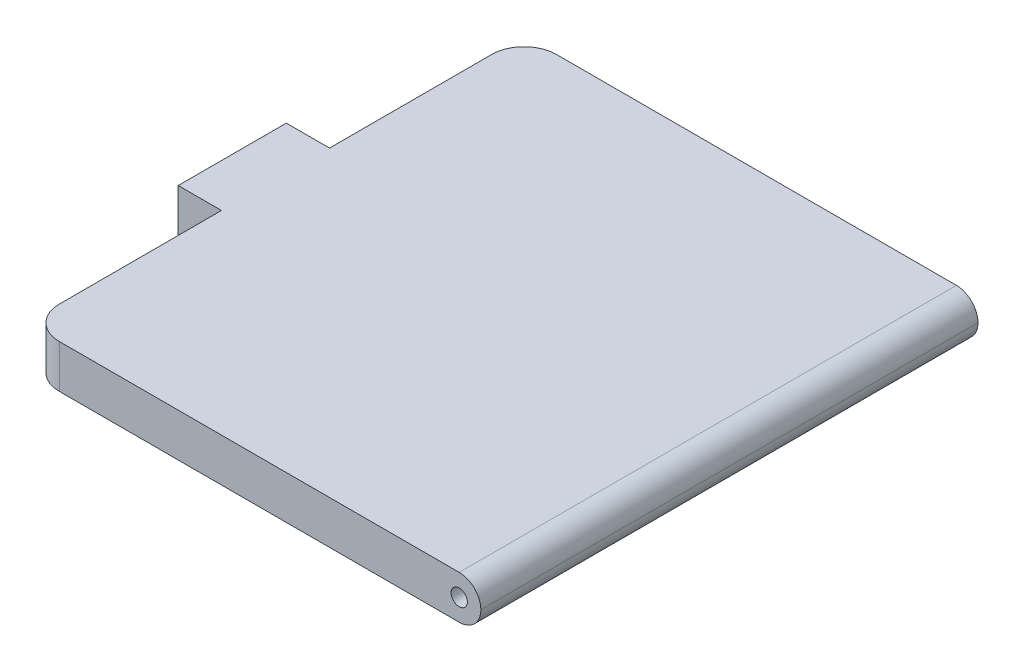
ISO-10303-21;
HEADER;
FILE_DESCRIPTION(('STEP AP214'),'2;1');
FILE_NAME('part.step','',(''),(''),'','','');
FILE_SCHEMA(('AUTOMOTIVE_DESIGN { 1 0 10303 214 1 1 1 1 }'));
ENDSEC;
DATA;
#1=APPLICATION_CONTEXT('core data for automotive mechanical design processes');
#2=APPLICATION_PROTOCOL_DEFINITION('international standard','automotive_design',2000,#1);
#3=PRODUCT_CONTEXT('',#1,'mechanical');
#4=PRODUCT('Part','Part','',(#3));
#5=PRODUCT_RELATED_PRODUCT_CATEGORY('part','',(#4));
#6=PRODUCT_DEFINITION_FORMATION('','',#4);
#7=PRODUCT_DEFINITION_CONTEXT('part definition',#1,'design');
#8=PRODUCT_DEFINITION('design','',#6,#7);
#9=PRODUCT_DEFINITION_SHAPE('','',#8);
#10=(LENGTH_UNIT() NAMED_UNIT(*) SI_UNIT(.MILLI.,.METRE.));
#11=(NAMED_UNIT(*) PLANE_ANGLE_UNIT() SI_UNIT($,.RADIAN.));
#12=(NAMED_UNIT(*) SI_UNIT($,.STERADIAN.) SOLID_ANGLE_UNIT());
#13=UNCERTAINTY_MEASURE_WITH_UNIT(LENGTH_MEASURE(1.E-05),#10,'distance_accuracy_value','');
#14=(GEOMETRIC_REPRESENTATION_CONTEXT(3) GLOBAL_UNCERTAINTY_ASSIGNED_CONTEXT((#13)) GLOBAL_UNIT_ASSIGNED_CONTEXT((#10,
#11,#12)) REPRESENTATION_CONTEXT('',''));
#15=CARTESIAN_POINT('',(0.,0.,0.));
#16=DIRECTION('',(0.,0.,1.));
#17=DIRECTION('',(1.,0.,0.));
#18=AXIS2_PLACEMENT_3D('',#15,#16,#17);
#19=CARTESIAN_POINT('',(-47.,1.,5.));
#20=DIRECTION('',(0.,1.,0.));
#21=DIRECTION('',(0.,0.,1.));
#22=AXIS2_PLACEMENT_3D('',#19,#20,#21);
#23=PLANE('',#22);
#24=DIRECTION('',(0.,0.,1.));
#25=VECTOR('',#24,1.);
#26=CARTESIAN_POINT('',(-45.,1.,5.));
#27=LINE('',#26,#25);
#28=CARTESIAN_POINT('',(-45.,1.,-5.));
#29=VERTEX_POINT('',#28);
#30=CARTESIAN_POINT('',(-45.,1.,5.));
#31=VERTEX_POINT('',#30);
#32=EDGE_CURVE('E147',#29,#31,#27,.T.);
#33=ORIENTED_EDGE('',*,*,#32,.F.);
#34=DIRECTION('',(1.,0.,0.));
#35=VECTOR('',#34,1.);
#36=CARTESIAN_POINT('',(-47.,1.,-5.));
#37=LINE('',#36,#35);
#38=CARTESIAN_POINT('',(-43.,1.,-5.));
#39=VERTEX_POINT('',#38);
#40=EDGE_CURVE('E152',#29,#39,#37,.T.);
#41=ORIENTED_EDGE('',*,*,#40,.T.);
#42=DIRECTION('',(0.,0.,1.));
#43=VECTOR('',#42,1.);
#44=CARTESIAN_POINT('',(-43.,1.,5.));
#45=LINE('',#44,#43);
#46=CARTESIAN_POINT('',(-43.,1.,5.));
#47=VERTEX_POINT('',#46);
#48=EDGE_CURVE('E155',#39,#47,#45,.T.);
#49=ORIENTED_EDGE('',*,*,#48,.T.);
#50=DIRECTION('',(1.,0.,0.));
#51=VECTOR('',#50,1.);
#52=CARTESIAN_POINT('',(-47.,1.,5.));
#53=LINE('',#52,#51);
#54=EDGE_CURVE('E172',#31,#47,#53,.T.);
#55=ORIENTED_EDGE('',*,*,#54,.F.);
#56=EDGE_LOOP('',(#33,#41,#49,#55));
#57=FACE_BOUND('',#56,.T.);
#58=ADVANCED_FACE('F32',(#57),#23,.F.);
#59=CARTESIAN_POINT('',(-43.,4.,20.));
#60=DIRECTION('',(1.,0.,0.));
#61=DIRECTION('',(0.,0.,-1.));
#62=AXIS2_PLACEMENT_3D('',#59,#60,#61);
#63=PLANE('',#62);
#64=DIRECTION('',(0.,-1.,0.));
#65=VECTOR('',#64,1.);
#66=CARTESIAN_POINT('',(-43.,1.,-5.));
#67=LINE('',#66,#65);
#68=CARTESIAN_POINT('',(-43.,4.,-5.));
#69=VERTEX_POINT('',#68);
#70=EDGE_CURVE('E153',#69,#39,#67,.T.);
#71=ORIENTED_EDGE('',*,*,#70,.F.);
#72=DIRECTION('',(0.,0.,1.));
#73=VECTOR('',#72,1.);
#74=CARTESIAN_POINT('',(-43.,4.,20.));
#75=LINE('',#74,#73);
#76=CARTESIAN_POINT('',(-43.,4.,-20.));
#77=VERTEX_POINT('',#76);
#78=EDGE_CURVE('E194',#77,#69,#75,.T.);
#79=ORIENTED_EDGE('',*,*,#78,.F.);
#80=DIRECTION('',(0.,-1.,0.));
#81=VECTOR('',#80,1.);
#82=CARTESIAN_POINT('',(-43.,4.,-20.));
#83=LINE('',#82,#81);
#84=CARTESIAN_POINT('',(-43.,0.,-20.));
#85=VERTEX_POINT('',#84);
#86=EDGE_CURVE('E211',#77,#85,#83,.T.);
#87=ORIENTED_EDGE('',*,*,#86,.T.);
#88=DIRECTION('',(0.,0.,1.));
#89=VECTOR('',#88,1.);
#90=CARTESIAN_POINT('',(-43.,0.,20.));
#91=LINE('',#90,#89);
#92=CARTESIAN_POINT('',(-43.,0.,20.));
#93=VERTEX_POINT('',#92);
#94=EDGE_CURVE('E187',#85,#93,#91,.T.);
#95=ORIENTED_EDGE('',*,*,#94,.T.);
#96=DIRECTION('',(0.,-1.,0.));
#97=VECTOR('',#96,1.);
#98=CARTESIAN_POINT('',(-43.,4.,20.));
#99=LINE('',#98,#97);
#100=CARTESIAN_POINT('',(-43.,4.,20.));
#101=VERTEX_POINT('',#100);
#102=EDGE_CURVE('E197',#101,#93,#99,.T.);
#103=ORIENTED_EDGE('',*,*,#102,.F.);
#104=CARTESIAN_POINT('',(-43.,4.,5.));
#105=VERTEX_POINT('',#104);
#106=EDGE_CURVE('E193',#105,#101,#75,.T.);
#107=ORIENTED_EDGE('',*,*,#106,.F.);
#108=DIRECTION('',(0.,1.,0.));
#109=VECTOR('',#108,1.);
#110=CARTESIAN_POINT('',(-43.,4.,5.));
#111=LINE('',#110,#109);
#112=EDGE_CURVE('E164',#47,#105,#111,.T.);
#113=ORIENTED_EDGE('',*,*,#112,.F.);
#114=ORIENTED_EDGE('',*,*,#48,.F.);
#115=EDGE_LOOP('',(#71,#79,#87,#95,#103,#107,#113,#114));
#116=FACE_BOUND('',#115,.T.);
#117=ADVANCED_FACE('F255',(#116),#63,.F.);
#118=CARTESIAN_POINT('',(-40.,4.,20.));
#119=DIRECTION('',(0.,-1.,0.));
#120=DIRECTION('',(0.,0.,-1.));
#121=AXIS2_PLACEMENT_3D('',#118,#119,#120);
#122=CYLINDRICAL_SURFACE('',#121,3.);
#123=CARTESIAN_POINT('',(-40.,0.,20.));
#124=DIRECTION('',(0.,1.,0.));
#125=DIRECTION('',(0.,0.,-1.));
#126=AXIS2_PLACEMENT_3D('',#123,#124,#125);
#127=CIRCLE('',#126,3.);
#128=CARTESIAN_POINT('',(-40.,0.,23.));
#129=VERTEX_POINT('',#128);
#130=EDGE_CURVE('E198',#93,#129,#127,.T.);
#131=ORIENTED_EDGE('',*,*,#130,.T.);
#132=DIRECTION('',(0.,-1.,0.));
#133=VECTOR('',#132,1.);
#134=CARTESIAN_POINT('',(-40.,4.,23.));
#135=LINE('',#134,#133);
#136=CARTESIAN_POINT('',(-40.,4.,23.));
#137=VERTEX_POINT('',#136);
#138=EDGE_CURVE('E217',#137,#129,#135,.T.);
#139=ORIENTED_EDGE('',*,*,#138,.F.);
#140=CARTESIAN_POINT('',(-40.,4.,20.));
#141=DIRECTION('',(0.,1.,0.));
#142=DIRECTION('',(0.,0.,-1.));
#143=AXIS2_PLACEMENT_3D('',#140,#141,#142);
#144=CIRCLE('',#143,3.);
#145=EDGE_CURVE('E183',#101,#137,#144,.T.);
#146=ORIENTED_EDGE('',*,*,#145,.F.);
#147=ORIENTED_EDGE('',*,*,#102,.T.);
#148=EDGE_LOOP('',(#131,#139,#146,#147));
#149=FACE_BOUND('',#148,.T.);
#150=ADVANCED_FACE('F263',(#149),#122,.T.);
#151=CARTESIAN_POINT('',(-0.999999999999994,4.,23.));
#152=DIRECTION('',(0.,0.,-1.));
#153=DIRECTION('',(-1.,0.,0.));
#154=AXIS2_PLACEMENT_3D('',#151,#152,#153);
#155=PLANE('',#154);
#156=CARTESIAN_POINT('',(-3.,2.,23.));
#157=DIRECTION('',(0.,0.,1.));
#158=DIRECTION('',(1.,0.,0.));
#159=AXIS2_PLACEMENT_3D('',#156,#157,#158);
#160=CIRCLE('',#159,0.75);
#161=CARTESIAN_POINT('',(-2.25,2.,23.));
#162=VERTEX_POINT('',#161);
#163=EDGE_CURVE('E177',#162,#162,#160,.T.);
#164=ORIENTED_EDGE('',*,*,#163,.F.);
#165=EDGE_LOOP('',(#164));
#166=FACE_BOUND('',#165,.T.);
#167=DIRECTION('',(1.,0.,0.));
#168=VECTOR('',#167,1.);
#169=CARTESIAN_POINT('',(-0.999999999999994,0.,23.));
#170=LINE('',#169,#168);
#171=CARTESIAN_POINT('',(-2.99999999999999,0.,23.));
#172=VERTEX_POINT('',#171);
#173=EDGE_CURVE('E201',#129,#172,#170,.T.);
#174=ORIENTED_EDGE('',*,*,#173,.T.);
#175=CARTESIAN_POINT('',(-2.99999999999999,2.,23.));
#176=DIRECTION('',(0.,0.,-1.));
#177=DIRECTION('',(-1.,0.,0.));
#178=AXIS2_PLACEMENT_3D('',#175,#176,#177);
#179=CIRCLE('',#178,2.);
#180=CARTESIAN_POINT('',(-0.999999999999994,2.,23.));
#181=VERTEX_POINT('',#180);
#182=EDGE_CURVE('E41',#172,#181,#179,.F.);
#183=ORIENTED_EDGE('',*,*,#182,.T.);
#184=CARTESIAN_POINT('',(-3.,2.,23.));
#185=DIRECTION('',(0.,0.,-1.));
#186=DIRECTION('',(-1.,0.,0.));
#187=AXIS2_PLACEMENT_3D('',#184,#185,#186);
#188=CIRCLE('',#187,2.);
#189=CARTESIAN_POINT('',(-3.,4.,23.));
#190=VERTEX_POINT('',#189);
#191=EDGE_CURVE('E56',#181,#190,#188,.F.);
#192=ORIENTED_EDGE('',*,*,#191,.T.);
#193=DIRECTION('',(1.,0.,0.));
#194=VECTOR('',#193,1.);
#195=CARTESIAN_POINT('',(-0.999999999999994,4.,23.));
#196=LINE('',#195,#194);
#197=EDGE_CURVE('E186',#137,#190,#196,.T.);
#198=ORIENTED_EDGE('',*,*,#197,.F.);
#199=ORIENTED_EDGE('',*,*,#138,.T.);
#200=EDGE_LOOP('',(#174,#183,#192,#198,#199));
#201=FACE_BOUND('',#200,.T.);
#202=ADVANCED_FACE('F228',(#166,#201),#155,.F.);
#203=CARTESIAN_POINT('',(-1.,4.,-23.));
#204=DIRECTION('',(0.,0.,1.));
#205=DIRECTION('',(1.,0.,0.));
#206=AXIS2_PLACEMENT_3D('',#203,#204,#205);
#207=PLANE('',#206);
#208=CARTESIAN_POINT('',(-3.,2.,-23.));
#209=DIRECTION('',(0.,0.,1.));
#210=DIRECTION('',(1.,0.,0.));
#211=AXIS2_PLACEMENT_3D('',#208,#209,#210);
#212=CIRCLE('',#211,0.75);
#213=CARTESIAN_POINT('',(-2.25,2.,-23.));
#214=VERTEX_POINT('',#213);
#215=EDGE_CURVE('E180',#214,#214,#212,.F.);
#216=ORIENTED_EDGE('',*,*,#215,.F.);
#217=EDGE_LOOP('',(#216));
#218=FACE_BOUND('',#217,.T.);
#219=CARTESIAN_POINT('',(-3.,2.,-23.));
#220=DIRECTION('',(0.,0.,1.));
#221=DIRECTION('',(1.,0.,0.));
#222=AXIS2_PLACEMENT_3D('',#219,#220,#221);
#223=CIRCLE('',#222,2.);
#224=CARTESIAN_POINT('',(-3.,4.,-23.));
#225=VERTEX_POINT('',#224);
#226=CARTESIAN_POINT('',(-1.,2.,-23.));
#227=VERTEX_POINT('',#226);
#228=EDGE_CURVE('E220',#225,#227,#223,.F.);
#229=ORIENTED_EDGE('',*,*,#228,.T.);
#230=CARTESIAN_POINT('',(-3.,2.,-23.));
#231=DIRECTION('',(0.,0.,1.));
#232=DIRECTION('',(1.,0.,0.));
#233=AXIS2_PLACEMENT_3D('',#230,#231,#232);
#234=CIRCLE('',#233,2.);
#235=CARTESIAN_POINT('',(-3.,0.,-23.));
#236=VERTEX_POINT('',#235);
#237=EDGE_CURVE('E222',#227,#236,#234,.F.);
#238=ORIENTED_EDGE('',*,*,#237,.T.);
#239=DIRECTION('',(-1.,0.,0.));
#240=VECTOR('',#239,1.);
#241=CARTESIAN_POINT('',(-1.,0.,-23.));
#242=LINE('',#241,#240);
#243=CARTESIAN_POINT('',(-40.,0.,-23.));
#244=VERTEX_POINT('',#243);
#245=EDGE_CURVE('E204',#236,#244,#242,.T.);
#246=ORIENTED_EDGE('',*,*,#245,.T.);
#247=DIRECTION('',(0.,-1.,0.));
#248=VECTOR('',#247,1.);
#249=CARTESIAN_POINT('',(-40.,4.,-23.));
#250=LINE('',#249,#248);
#251=CARTESIAN_POINT('',(-40.,4.,-23.));
#252=VERTEX_POINT('',#251);
#253=EDGE_CURVE('E214',#252,#244,#250,.T.);
#254=ORIENTED_EDGE('',*,*,#253,.F.);
#255=DIRECTION('',(-1.,0.,0.));
#256=VECTOR('',#255,1.);
#257=CARTESIAN_POINT('',(-1.,4.,-23.));
#258=LINE('',#257,#256);
#259=EDGE_CURVE('E189',#225,#252,#258,.T.);
#260=ORIENTED_EDGE('',*,*,#259,.F.);
#261=EDGE_LOOP('',(#229,#238,#246,#254,#260));
#262=FACE_BOUND('',#261,.T.);
#263=ADVANCED_FACE('F240',(#218,#262),#207,.F.);
#264=CARTESIAN_POINT('',(-40.,4.,-20.));
#265=DIRECTION('',(0.,-1.,0.));
#266=DIRECTION('',(0.,0.,-1.));
#267=AXIS2_PLACEMENT_3D('',#264,#265,#266);
#268=CYLINDRICAL_SURFACE('',#267,3.);
#269=CARTESIAN_POINT('',(-40.,0.,-20.));
#270=DIRECTION('',(0.,1.,0.));
#271=DIRECTION('',(0.,0.,1.));
#272=AXIS2_PLACEMENT_3D('',#269,#270,#271);
#273=CIRCLE('',#272,3.);
#274=EDGE_CURVE('E206',#244,#85,#273,.T.);
#275=ORIENTED_EDGE('',*,*,#274,.T.);
#276=ORIENTED_EDGE('',*,*,#86,.F.);
#277=CARTESIAN_POINT('',(-40.,4.,-20.));
#278=DIRECTION('',(0.,1.,0.));
#279=DIRECTION('',(0.,0.,1.));
#280=AXIS2_PLACEMENT_3D('',#277,#278,#279);
#281=CIRCLE('',#280,3.);
#282=EDGE_CURVE('E191',#252,#77,#281,.T.);
#283=ORIENTED_EDGE('',*,*,#282,.F.);
#284=ORIENTED_EDGE('',*,*,#253,.T.);
#285=EDGE_LOOP('',(#275,#276,#283,#284));
#286=FACE_BOUND('',#285,.T.);
#287=ADVANCED_FACE('F250',(#286),#268,.T.);
#288=CARTESIAN_POINT('',(-40.,4.,20.));
#289=DIRECTION('',(0.,-1.,0.));
#290=DIRECTION('',(0.,0.,-1.));
#291=AXIS2_PLACEMENT_3D('',#288,#289,#290);
#292=PLANE('',#291);
#293=ORIENTED_EDGE('',*,*,#197,.T.);
#294=DIRECTION('',(0.,0.,-1.));
#295=VECTOR('',#294,1.);
#296=CARTESIAN_POINT('',(-3.,4.,20.));
#297=LINE('',#296,#295);
#298=EDGE_CURVE('E11',#190,#225,#297,.T.);
#299=ORIENTED_EDGE('',*,*,#298,.T.);
#300=ORIENTED_EDGE('',*,*,#259,.T.);
#301=ORIENTED_EDGE('',*,*,#282,.T.);
#302=ORIENTED_EDGE('',*,*,#78,.T.);
#303=DIRECTION('',(1.,0.,0.));
#304=VECTOR('',#303,1.);
#305=CARTESIAN_POINT('',(-47.,4.,-5.));
#306=LINE('',#305,#304);
#307=CARTESIAN_POINT('',(-47.,4.,-5.));
#308=VERTEX_POINT('',#307);
#309=EDGE_CURVE('E175',#308,#69,#306,.T.);
#310=ORIENTED_EDGE('',*,*,#309,.F.);
#311=DIRECTION('',(0.,0.,-1.));
#312=VECTOR('',#311,1.);
#313=CARTESIAN_POINT('',(-47.,4.,-5.));
#314=LINE('',#313,#312);
#315=CARTESIAN_POINT('',(-47.,4.,5.));
#316=VERTEX_POINT('',#315);
#317=EDGE_CURVE('E160',#316,#308,#314,.T.);
#318=ORIENTED_EDGE('',*,*,#317,.F.);
#319=DIRECTION('',(1.,0.,0.));
#320=VECTOR('',#319,1.);
#321=CARTESIAN_POINT('',(-47.,4.,5.));
#322=LINE('',#321,#320);
#323=EDGE_CURVE('E48',#316,#105,#322,.T.);
#324=ORIENTED_EDGE('',*,*,#323,.T.);
#325=ORIENTED_EDGE('',*,*,#106,.T.);
#326=ORIENTED_EDGE('',*,*,#145,.T.);
#327=EDGE_LOOP('',(#293,#299,#300,#301,#302,#310,#318,#324,#325,#326));
#328=FACE_BOUND('',#327,.T.);
#329=ADVANCED_FACE('F259',(#328),#292,.F.);
#330=CARTESIAN_POINT('',(-40.,0.,20.));
#331=DIRECTION('',(0.,-1.,0.));
#332=DIRECTION('',(0.,0.,-1.));
#333=AXIS2_PLACEMENT_3D('',#330,#331,#332);
#334=PLANE('',#333);
#335=ORIENTED_EDGE('',*,*,#245,.F.);
#336=DIRECTION('',(0.,0.,-1.));
#337=VECTOR('',#336,1.);
#338=CARTESIAN_POINT('',(-2.99999999999999,0.,23.));
#339=LINE('',#338,#337);
#340=EDGE_CURVE('E224',#236,#172,#339,.F.);
#341=ORIENTED_EDGE('',*,*,#340,.T.);
#342=ORIENTED_EDGE('',*,*,#173,.F.);
#343=ORIENTED_EDGE('',*,*,#130,.F.);
#344=ORIENTED_EDGE('',*,*,#94,.F.);
#345=ORIENTED_EDGE('',*,*,#274,.F.);
#346=EDGE_LOOP('',(#335,#341,#342,#343,#344,#345));
#347=FACE_BOUND('',#346,.T.);
#348=ADVANCED_FACE('F245',(#347),#334,.T.);
#349=CARTESIAN_POINT('',(-3.,2.,20.));
#350=DIRECTION('',(0.,0.,-1.));
#351=DIRECTION('',(-1.,0.,0.));
#352=AXIS2_PLACEMENT_3D('',#349,#350,#351);
#353=CYLINDRICAL_SURFACE('',#352,2.);
#354=ORIENTED_EDGE('',*,*,#298,.F.);
#355=ORIENTED_EDGE('',*,*,#191,.F.);
#356=DIRECTION('',(0.,0.,-1.));
#357=VECTOR('',#356,1.);
#358=CARTESIAN_POINT('',(-1.,2.,-23.));
#359=LINE('',#358,#357);
#360=EDGE_CURVE('E36',#227,#181,#359,.F.);
#361=ORIENTED_EDGE('',*,*,#360,.F.);
#362=ORIENTED_EDGE('',*,*,#228,.F.);
#363=EDGE_LOOP('',(#354,#355,#361,#362));
#364=FACE_BOUND('',#363,.T.);
#365=ADVANCED_FACE('F34',(#364),#353,.T.);
#366=CARTESIAN_POINT('',(-3.,2.,-23.));
#367=DIRECTION('',(0.,0.,1.));
#368=DIRECTION('',(1.,0.,0.));
#369=AXIS2_PLACEMENT_3D('',#366,#367,#368);
#370=CYLINDRICAL_SURFACE('',#369,2.);
#371=ORIENTED_EDGE('',*,*,#182,.F.);
#372=ORIENTED_EDGE('',*,*,#340,.F.);
#373=ORIENTED_EDGE('',*,*,#237,.F.);
#374=ORIENTED_EDGE('',*,*,#360,.T.);
#375=EDGE_LOOP('',(#371,#372,#373,#374));
#376=FACE_BOUND('',#375,.T.);
#377=ADVANCED_FACE('F237',(#376),#370,.T.);
#378=CARTESIAN_POINT('',(-3.,2.,-25.1213203435596));
#379=DIRECTION('',(0.,0.,1.));
#380=DIRECTION('',(1.,0.,0.));
#381=AXIS2_PLACEMENT_3D('',#378,#379,#380);
#382=CYLINDRICAL_SURFACE('',#381,0.75);
#383=ORIENTED_EDGE('',*,*,#215,.T.);
#384=EDGE_LOOP('',(#383));
#385=FACE_BOUND('',#384,.T.);
#386=ORIENTED_EDGE('',*,*,#163,.T.);
#387=EDGE_LOOP('',(#386));
#388=FACE_BOUND('',#387,.T.);
#389=ADVANCED_FACE('F291',(#385,#388),#382,.F.);
#390=CARTESIAN_POINT('',(-47.,1.,-5.));
#391=DIRECTION('',(0.,0.,1.));
#392=DIRECTION('',(0.,-1.,0.));
#393=AXIS2_PLACEMENT_3D('',#390,#391,#392);
#394=PLANE('',#393);
#395=ORIENTED_EDGE('',*,*,#70,.T.);
#396=ORIENTED_EDGE('',*,*,#40,.F.);
#397=DIRECTION('',(0.,1.,0.));
#398=VECTOR('',#397,1.);
#399=CARTESIAN_POINT('',(-45.,-4.,-5.));
#400=LINE('',#399,#398);
#401=CARTESIAN_POINT('',(-45.,-4.,-5.));
#402=VERTEX_POINT('',#401);
#403=EDGE_CURVE('E131',#402,#29,#400,.T.);
#404=ORIENTED_EDGE('',*,*,#403,.F.);
#405=DIRECTION('',(1.,0.,0.));
#406=VECTOR('',#405,1.);
#407=CARTESIAN_POINT('',(-45.,-4.,-5.));
#408=LINE('',#407,#406);
#409=CARTESIAN_POINT('',(-47.,-4.,-5.));
#410=VERTEX_POINT('',#409);
#411=EDGE_CURVE('E139',#410,#402,#408,.T.);
#412=ORIENTED_EDGE('',*,*,#411,.F.);
#413=DIRECTION('',(0.,-1.,0.));
#414=VECTOR('',#413,1.);
#415=CARTESIAN_POINT('',(-47.,1.,-5.));
#416=LINE('',#415,#414);
#417=EDGE_CURVE('E163',#308,#410,#416,.T.);
#418=ORIENTED_EDGE('',*,*,#417,.F.);
#419=ORIENTED_EDGE('',*,*,#309,.T.);
#420=EDGE_LOOP('',(#395,#396,#404,#412,#418,#419));
#421=FACE_BOUND('',#420,.T.);
#422=ADVANCED_FACE('F151',(#421),#394,.F.);
#423=CARTESIAN_POINT('',(-47.,4.,5.));
#424=DIRECTION('',(0.,0.,-1.));
#425=DIRECTION('',(0.,1.,0.));
#426=AXIS2_PLACEMENT_3D('',#423,#424,#425);
#427=PLANE('',#426);
#428=ORIENTED_EDGE('',*,*,#112,.T.);
#429=ORIENTED_EDGE('',*,*,#323,.F.);
#430=DIRECTION('',(0.,1.,0.));
#431=VECTOR('',#430,1.);
#432=CARTESIAN_POINT('',(-47.,4.,5.));
#433=LINE('',#432,#431);
#434=CARTESIAN_POINT('',(-47.,-4.,5.));
#435=VERTEX_POINT('',#434);
#436=EDGE_CURVE('E166',#435,#316,#433,.T.);
#437=ORIENTED_EDGE('',*,*,#436,.F.);
#438=DIRECTION('',(-1.,0.,0.));
#439=VECTOR('',#438,1.);
#440=CARTESIAN_POINT('',(-47.,-4.,5.));
#441=LINE('',#440,#439);
#442=CARTESIAN_POINT('',(-45.,-4.,5.));
#443=VERTEX_POINT('',#442);
#444=EDGE_CURVE('E138',#443,#435,#441,.T.);
#445=ORIENTED_EDGE('',*,*,#444,.F.);
#446=DIRECTION('',(0.,1.,0.));
#447=VECTOR('',#446,1.);
#448=CARTESIAN_POINT('',(-45.,-4.,5.));
#449=LINE('',#448,#447);
#450=EDGE_CURVE('E134',#443,#31,#449,.T.);
#451=ORIENTED_EDGE('',*,*,#450,.T.);
#452=ORIENTED_EDGE('',*,*,#54,.T.);
#453=EDGE_LOOP('',(#428,#429,#437,#445,#451,#452));
#454=FACE_BOUND('',#453,.T.);
#455=ADVANCED_FACE('F267',(#454),#427,.F.);
#456=CARTESIAN_POINT('',(-47.,0.,0.));
#457=DIRECTION('',(1.,0.,0.));
#458=DIRECTION('',(0.,0.,-1.));
#459=AXIS2_PLACEMENT_3D('',#456,#457,#458);
#460=PLANE('',#459);
#461=ORIENTED_EDGE('',*,*,#317,.T.);
#462=ORIENTED_EDGE('',*,*,#417,.T.);
#463=DIRECTION('',(0.,0.,-1.));
#464=VECTOR('',#463,1.);
#465=CARTESIAN_POINT('',(-47.,-4.,-5.));
#466=LINE('',#465,#464);
#467=EDGE_CURVE('E145',#435,#410,#466,.T.);
#468=ORIENTED_EDGE('',*,*,#467,.F.);
#469=ORIENTED_EDGE('',*,*,#436,.T.);
#470=EDGE_LOOP('',(#461,#462,#468,#469));
#471=FACE_BOUND('',#470,.T.);
#472=ADVANCED_FACE('F271',(#471),#460,.F.);
#473=CARTESIAN_POINT('',(-45.,-4.,5.));
#474=DIRECTION('',(-1.,0.,0.));
#475=DIRECTION('',(0.,0.,1.));
#476=AXIS2_PLACEMENT_3D('',#473,#474,#475);
#477=PLANE('',#476);
#478=ORIENTED_EDGE('',*,*,#32,.T.);
#479=ORIENTED_EDGE('',*,*,#450,.F.);
#480=DIRECTION('',(0.,0.,1.));
#481=VECTOR('',#480,1.);
#482=CARTESIAN_POINT('',(-45.,-4.,5.));
#483=LINE('',#482,#481);
#484=EDGE_CURVE('E127',#402,#443,#483,.T.);
#485=ORIENTED_EDGE('',*,*,#484,.F.);
#486=ORIENTED_EDGE('',*,*,#403,.T.);
#487=EDGE_LOOP('',(#478,#479,#485,#486));
#488=FACE_BOUND('',#487,.T.);
#489=ADVANCED_FACE('F129',(#488),#477,.F.);
#490=CARTESIAN_POINT('',(0.,-4.,0.));
#491=DIRECTION('',(0.,1.,0.));
#492=DIRECTION('',(0.,0.,1.));
#493=AXIS2_PLACEMENT_3D('',#490,#491,#492);
#494=PLANE('',#493);
#495=ORIENTED_EDGE('',*,*,#411,.T.);
#496=ORIENTED_EDGE('',*,*,#484,.T.);
#497=ORIENTED_EDGE('',*,*,#444,.T.);
#498=ORIENTED_EDGE('',*,*,#467,.T.);
#499=EDGE_LOOP('',(#495,#496,#497,#498));
#500=FACE_BOUND('',#499,.T.);
#501=ADVANCED_FACE('F143',(#500),#494,.F.);
#502=CLOSED_SHELL('',(#58,#117,#150,#202,#263,#287,#329,#348,#365,#377,#389,#422,#455,#472,#489,#501));
#503=MANIFOLD_SOLID_BREP('B2',#502);
#504=ADVANCED_BREP_SHAPE_REPRESENTATION('',(#18,#503),#14);
#505=SHAPE_DEFINITION_REPRESENTATION(#9,#504);
ENDSEC;
END-ISO-10303-21;
